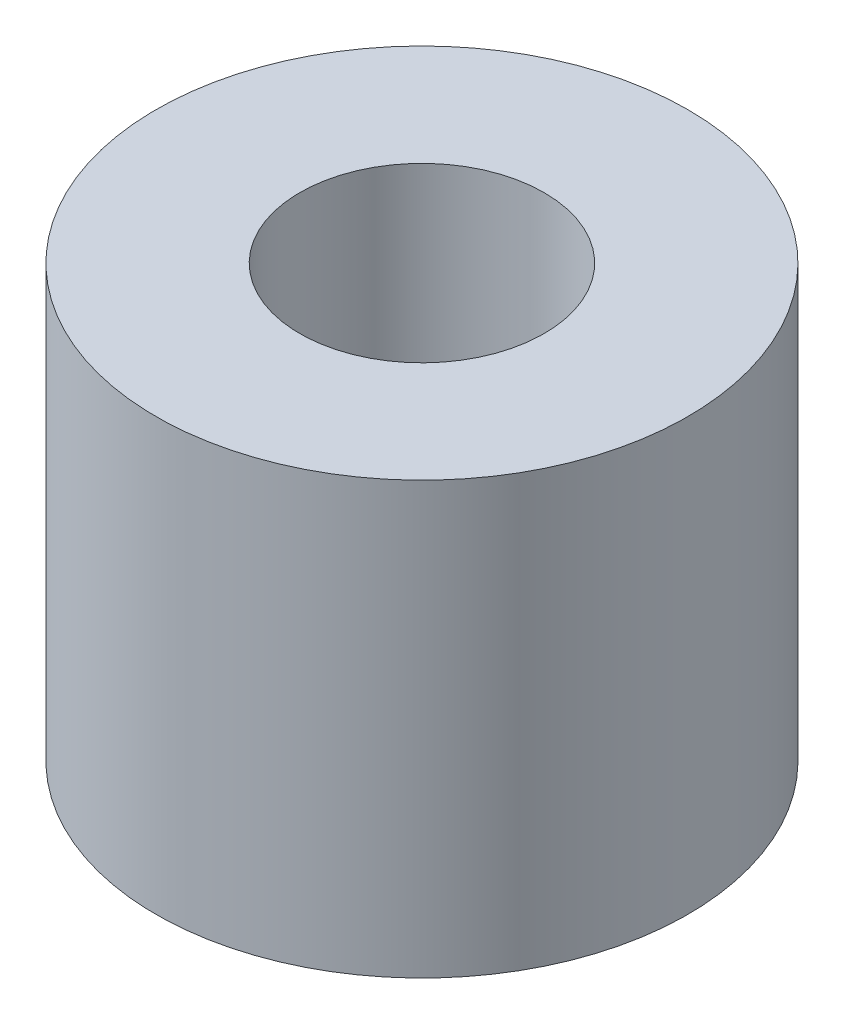
ISO-10303-21;
HEADER;
FILE_DESCRIPTION(('STEP AP214'),'2;1');
FILE_NAME('part.step','',(''),(''),'','','');
FILE_SCHEMA(('AUTOMOTIVE_DESIGN { 1 0 10303 214 1 1 1 1 }'));
ENDSEC;
DATA;
#1=APPLICATION_CONTEXT('core data for automotive mechanical design processes');
#2=APPLICATION_PROTOCOL_DEFINITION('international standard','automotive_design',2000,#1);
#3=PRODUCT_CONTEXT('',#1,'mechanical');
#4=PRODUCT('Part','Part','',(#3));
#5=PRODUCT_RELATED_PRODUCT_CATEGORY('part','',(#4));
#6=PRODUCT_DEFINITION_FORMATION('','',#4);
#7=PRODUCT_DEFINITION_CONTEXT('part definition',#1,'design');
#8=PRODUCT_DEFINITION('design','',#6,#7);
#9=PRODUCT_DEFINITION_SHAPE('','',#8);
#10=(LENGTH_UNIT() NAMED_UNIT(*) SI_UNIT(.MILLI.,.METRE.));
#11=(NAMED_UNIT(*) PLANE_ANGLE_UNIT() SI_UNIT($,.RADIAN.));
#12=(NAMED_UNIT(*) SI_UNIT($,.STERADIAN.) SOLID_ANGLE_UNIT());
#13=UNCERTAINTY_MEASURE_WITH_UNIT(LENGTH_MEASURE(1.E-05),#10,'distance_accuracy_value','');
#14=(GEOMETRIC_REPRESENTATION_CONTEXT(3) GLOBAL_UNCERTAINTY_ASSIGNED_CONTEXT((#13)) GLOBAL_UNIT_ASSIGNED_CONTEXT((#10,
#11,#12)) REPRESENTATION_CONTEXT('',''));
#15=CARTESIAN_POINT('',(0.,0.,0.));
#16=DIRECTION('',(0.,0.,1.));
#17=DIRECTION('',(1.,0.,0.));
#18=AXIS2_PLACEMENT_3D('',#15,#16,#17);
#19=CARTESIAN_POINT('',(0.,-7.,0.));
#20=DIRECTION('',(0.,-1.,0.));
#21=DIRECTION('',(0.,0.,-1.));
#22=AXIS2_PLACEMENT_3D('',#19,#20,#21);
#23=CYLINDRICAL_SURFACE('',#22,1.7);
#24=CARTESIAN_POINT('',(0.,-3.,0.));
#25=DIRECTION('',(0.,-1.,0.));
#26=DIRECTION('',(0.,0.,-1.));
#27=AXIS2_PLACEMENT_3D('',#24,#25,#26);
#28=CIRCLE('',#27,1.7);
#29=CARTESIAN_POINT('',(0.,-3.,-1.7));
#30=VERTEX_POINT('',#29);
#31=EDGE_CURVE('E10',#30,#30,#28,.T.);
#32=ORIENTED_EDGE('',*,*,#31,.T.);
#33=EDGE_LOOP('',(#32));
#34=FACE_BOUND('',#33,.T.);
#35=CARTESIAN_POINT('',(0.,3.,0.));
#36=DIRECTION('',(0.,-1.,0.));
#37=DIRECTION('',(0.,0.,-1.));
#38=AXIS2_PLACEMENT_3D('',#35,#36,#37);
#39=CIRCLE('',#38,1.7);
#40=CARTESIAN_POINT('',(0.,3.,-1.7));
#41=VERTEX_POINT('',#40);
#42=EDGE_CURVE('E45',#41,#41,#39,.T.);
#43=ORIENTED_EDGE('',*,*,#42,.F.);
#44=EDGE_LOOP('',(#43));
#45=FACE_BOUND('',#44,.T.);
#46=ADVANCED_FACE('F31',(#34,#45),#23,.F.);
#47=CARTESIAN_POINT('',(1.7,-3.,0.));
#48=DIRECTION('',(0.,-1.,0.));
#49=DIRECTION('',(0.,0.,-1.));
#50=AXIS2_PLACEMENT_3D('',#47,#48,#49);
#51=PLANE('',#50);
#52=CARTESIAN_POINT('',(0.,-3.,0.));
#53=DIRECTION('',(0.,-1.,0.));
#54=DIRECTION('',(0.,0.,-1.));
#55=AXIS2_PLACEMENT_3D('',#52,#53,#54);
#56=CIRCLE('',#55,3.7);
#57=CARTESIAN_POINT('',(0.,-3.,-3.7));
#58=VERTEX_POINT('',#57);
#59=EDGE_CURVE('E37',#58,#58,#56,.T.);
#60=ORIENTED_EDGE('',*,*,#59,.T.);
#61=EDGE_LOOP('',(#60));
#62=FACE_BOUND('',#61,.T.);
#63=ORIENTED_EDGE('',*,*,#31,.F.);
#64=EDGE_LOOP('',(#63));
#65=FACE_BOUND('',#64,.T.);
#66=ADVANCED_FACE('F55',(#62,#65),#51,.T.);
#67=CARTESIAN_POINT('',(0.,-7.,0.));
#68=DIRECTION('',(0.,-1.,0.));
#69=DIRECTION('',(0.,0.,-1.));
#70=AXIS2_PLACEMENT_3D('',#67,#68,#69);
#71=CYLINDRICAL_SURFACE('',#70,3.7);
#72=CARTESIAN_POINT('',(0.,3.,0.));
#73=DIRECTION('',(0.,-1.,0.));
#74=DIRECTION('',(0.,0.,-1.));
#75=AXIS2_PLACEMENT_3D('',#72,#73,#74);
#76=CIRCLE('',#75,3.7);
#77=CARTESIAN_POINT('',(0.,3.,-3.7));
#78=VERTEX_POINT('',#77);
#79=EDGE_CURVE('E41',#78,#78,#76,.T.);
#80=ORIENTED_EDGE('',*,*,#79,.T.);
#81=EDGE_LOOP('',(#80));
#82=FACE_BOUND('',#81,.T.);
#83=ORIENTED_EDGE('',*,*,#59,.F.);
#84=EDGE_LOOP('',(#83));
#85=FACE_BOUND('',#84,.T.);
#86=ADVANCED_FACE('F59',(#82,#85),#71,.T.);
#87=CARTESIAN_POINT('',(3.7,3.,0.));
#88=DIRECTION('',(0.,1.,0.));
#89=DIRECTION('',(0.,0.,1.));
#90=AXIS2_PLACEMENT_3D('',#87,#88,#89);
#91=PLANE('',#90);
#92=ORIENTED_EDGE('',*,*,#42,.T.);
#93=EDGE_LOOP('',(#92));
#94=FACE_BOUND('',#93,.T.);
#95=ORIENTED_EDGE('',*,*,#79,.F.);
#96=EDGE_LOOP('',(#95));
#97=FACE_BOUND('',#96,.T.);
#98=ADVANCED_FACE('F51',(#94,#97),#91,.T.);
#99=CLOSED_SHELL('',(#46,#66,#86,#98));
#100=MANIFOLD_SOLID_BREP('B2',#99);
#101=ADVANCED_BREP_SHAPE_REPRESENTATION('',(#18,#100),#14);
#102=SHAPE_DEFINITION_REPRESENTATION(#9,#101);
ENDSEC;
END-ISO-10303-21;
